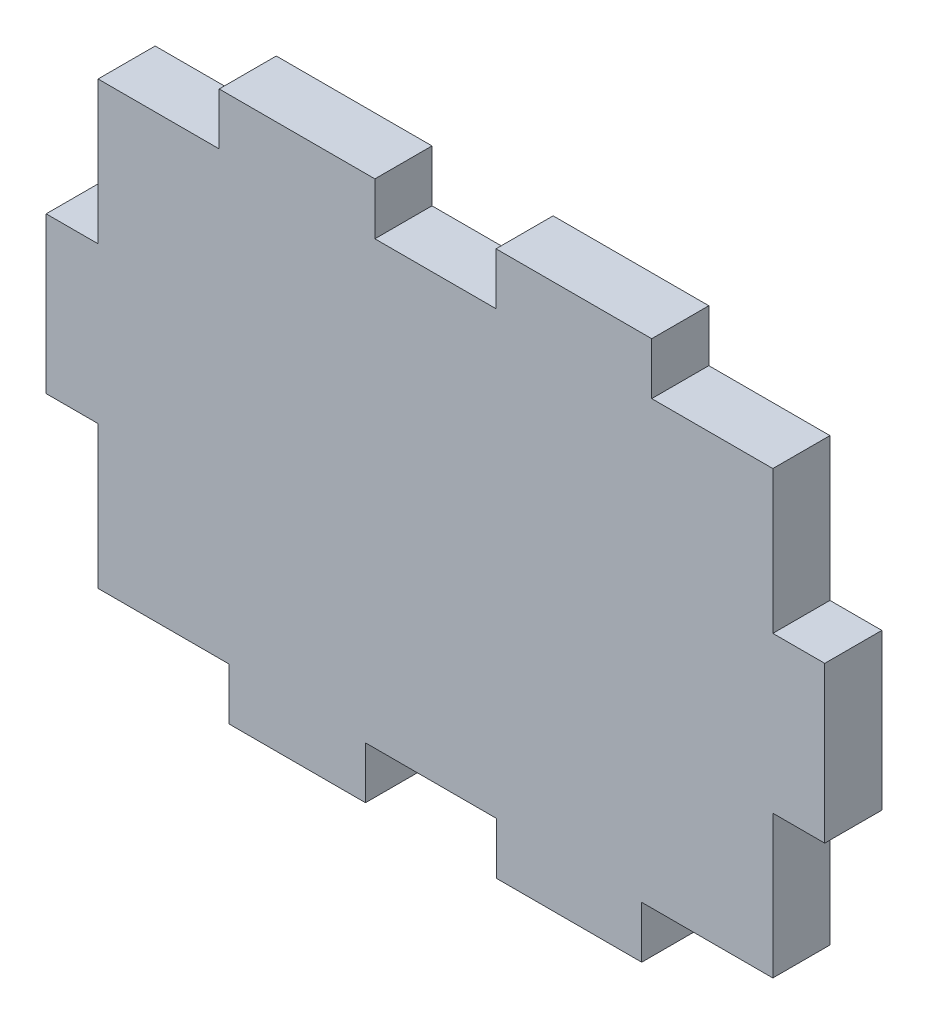
ISO-10303-21;
HEADER;
FILE_DESCRIPTION(('STEP AP214'),'2;1');
FILE_NAME('part.step','',(''),(''),'','','');
FILE_SCHEMA(('AUTOMOTIVE_DESIGN { 1 0 10303 214 1 1 1 1 }'));
ENDSEC;
DATA;
#1=APPLICATION_CONTEXT('core data for automotive mechanical design processes');
#2=APPLICATION_PROTOCOL_DEFINITION('international standard','automotive_design',2000,#1);
#3=PRODUCT_CONTEXT('',#1,'mechanical');
#4=PRODUCT('Part','Part','',(#3));
#5=PRODUCT_RELATED_PRODUCT_CATEGORY('part','',(#4));
#6=PRODUCT_DEFINITION_FORMATION('','',#4);
#7=PRODUCT_DEFINITION_CONTEXT('part definition',#1,'design');
#8=PRODUCT_DEFINITION('design','',#6,#7);
#9=PRODUCT_DEFINITION_SHAPE('','',#8);
#10=(LENGTH_UNIT() NAMED_UNIT(*) SI_UNIT(.MILLI.,.METRE.));
#11=(NAMED_UNIT(*) PLANE_ANGLE_UNIT() SI_UNIT($,.RADIAN.));
#12=(NAMED_UNIT(*) SI_UNIT($,.STERADIAN.) SOLID_ANGLE_UNIT());
#13=UNCERTAINTY_MEASURE_WITH_UNIT(LENGTH_MEASURE(1.E-05),#10,'distance_accuracy_value','');
#14=(GEOMETRIC_REPRESENTATION_CONTEXT(3) GLOBAL_UNCERTAINTY_ASSIGNED_CONTEXT((#13)) GLOBAL_UNIT_ASSIGNED_CONTEXT((#10,
#11,#12)) REPRESENTATION_CONTEXT('',''));
#15=CARTESIAN_POINT('',(0.,0.,0.));
#16=DIRECTION('',(0.,0.,1.));
#17=DIRECTION('',(1.,0.,0.));
#18=AXIS2_PLACEMENT_3D('',#15,#16,#17);
#19=CARTESIAN_POINT('',(33.02,7.62,5.588));
#20=DIRECTION('',(-1.,0.,0.));
#21=DIRECTION('',(0.,0.,1.));
#22=AXIS2_PLACEMENT_3D('',#19,#20,#21);
#23=PLANE('',#22);
#24=DIRECTION('',(0.,1.,0.));
#25=VECTOR('',#24,1.);
#26=CARTESIAN_POINT('',(33.02,7.62,0.));
#27=LINE('',#26,#25);
#28=CARTESIAN_POINT('',(33.02,7.62,0.));
#29=VERTEX_POINT('',#28);
#30=CARTESIAN_POINT('',(33.02,21.59,0.));
#31=VERTEX_POINT('',#30);
#32=EDGE_CURVE('E249',#29,#31,#27,.T.);
#33=ORIENTED_EDGE('',*,*,#32,.T.);
#34=DIRECTION('',(0.,0.,-1.));
#35=VECTOR('',#34,1.);
#36=CARTESIAN_POINT('',(33.02,21.59,5.588));
#37=LINE('',#36,#35);
#38=CARTESIAN_POINT('',(33.02,21.59,5.588));
#39=VERTEX_POINT('',#38);
#40=EDGE_CURVE('E11',#39,#31,#37,.T.);
#41=ORIENTED_EDGE('',*,*,#40,.F.);
#42=DIRECTION('',(0.,1.,0.));
#43=VECTOR('',#42,1.);
#44=CARTESIAN_POINT('',(33.02,7.62,5.588));
#45=LINE('',#44,#43);
#46=CARTESIAN_POINT('',(33.02,7.62,5.588));
#47=VERTEX_POINT('',#46);
#48=EDGE_CURVE('E303',#47,#39,#45,.T.);
#49=ORIENTED_EDGE('',*,*,#48,.F.);
#50=DIRECTION('',(0.,0.,-1.));
#51=VECTOR('',#50,1.);
#52=CARTESIAN_POINT('',(33.02,7.62,5.588));
#53=LINE('',#52,#51);
#54=EDGE_CURVE('E245',#47,#29,#53,.T.);
#55=ORIENTED_EDGE('',*,*,#54,.T.);
#56=EDGE_LOOP('',(#33,#41,#49,#55));
#57=FACE_BOUND('',#56,.T.);
#58=ADVANCED_FACE('F33',(#57),#23,.F.);
#59=CARTESIAN_POINT('',(21.1666666666667,21.59,5.588));
#60=DIRECTION('',(0.,-1.,0.));
#61=DIRECTION('',(0.,0.,-1.));
#62=AXIS2_PLACEMENT_3D('',#59,#60,#61);
#63=PLANE('',#62);
#64=DIRECTION('',(-1.,0.,0.));
#65=VECTOR('',#64,1.);
#66=CARTESIAN_POINT('',(21.1666666666667,21.59,0.));
#67=LINE('',#66,#65);
#68=CARTESIAN_POINT('',(21.1666666666667,21.59,0.));
#69=VERTEX_POINT('',#68);
#70=EDGE_CURVE('E252',#31,#69,#67,.T.);
#71=ORIENTED_EDGE('',*,*,#70,.T.);
#72=DIRECTION('',(0.,0.,-1.));
#73=VECTOR('',#72,1.);
#74=CARTESIAN_POINT('',(21.1666666666667,21.59,5.588));
#75=LINE('',#74,#73);
#76=CARTESIAN_POINT('',(21.1666666666667,21.59,5.588));
#77=VERTEX_POINT('',#76);
#78=EDGE_CURVE('E41',#77,#69,#75,.T.);
#79=ORIENTED_EDGE('',*,*,#78,.F.);
#80=DIRECTION('',(-1.,0.,0.));
#81=VECTOR('',#80,1.);
#82=CARTESIAN_POINT('',(21.1666666666667,21.59,5.588));
#83=LINE('',#82,#81);
#84=EDGE_CURVE('E152',#39,#77,#83,.T.);
#85=ORIENTED_EDGE('',*,*,#84,.F.);
#86=ORIENTED_EDGE('',*,*,#40,.T.);
#87=EDGE_LOOP('',(#71,#79,#85,#86));
#88=FACE_BOUND('',#87,.T.);
#89=ADVANCED_FACE('F461',(#88),#63,.F.);
#90=CARTESIAN_POINT('',(21.1666666666667,21.59,5.588));
#91=DIRECTION('',(-1.,0.,0.));
#92=DIRECTION('',(0.,0.,1.));
#93=AXIS2_PLACEMENT_3D('',#90,#91,#92);
#94=PLANE('',#93);
#95=DIRECTION('',(0.,1.,0.));
#96=VECTOR('',#95,1.);
#97=CARTESIAN_POINT('',(21.1666666666667,21.59,0.));
#98=LINE('',#97,#96);
#99=CARTESIAN_POINT('',(21.1666666666667,26.67,0.));
#100=VERTEX_POINT('',#99);
#101=EDGE_CURVE('E254',#69,#100,#98,.T.);
#102=ORIENTED_EDGE('',*,*,#101,.T.);
#103=DIRECTION('',(0.,0.,-1.));
#104=VECTOR('',#103,1.);
#105=CARTESIAN_POINT('',(21.1666666666667,26.67,5.588));
#106=LINE('',#105,#104);
#107=CARTESIAN_POINT('',(21.1666666666667,26.67,5.588));
#108=VERTEX_POINT('',#107);
#109=EDGE_CURVE('E370',#108,#100,#106,.T.);
#110=ORIENTED_EDGE('',*,*,#109,.F.);
#111=DIRECTION('',(0.,1.,0.));
#112=VECTOR('',#111,1.);
#113=CARTESIAN_POINT('',(21.1666666666667,21.59,5.588));
#114=LINE('',#113,#112);
#115=EDGE_CURVE('E378',#77,#108,#114,.T.);
#116=ORIENTED_EDGE('',*,*,#115,.F.);
#117=ORIENTED_EDGE('',*,*,#78,.T.);
#118=EDGE_LOOP('',(#102,#110,#116,#117));
#119=FACE_BOUND('',#118,.T.);
#120=ADVANCED_FACE('F376',(#119),#94,.F.);
#121=CARTESIAN_POINT('',(5.92666666666666,26.67,5.588));
#122=DIRECTION('',(0.,-1.,0.));
#123=DIRECTION('',(0.,0.,-1.));
#124=AXIS2_PLACEMENT_3D('',#121,#122,#123);
#125=PLANE('',#124);
#126=DIRECTION('',(-1.,0.,0.));
#127=VECTOR('',#126,1.);
#128=CARTESIAN_POINT('',(5.92666666666666,26.67,0.));
#129=LINE('',#128,#127);
#130=CARTESIAN_POINT('',(5.92666666666666,26.67,0.));
#131=VERTEX_POINT('',#130);
#132=EDGE_CURVE('E256',#100,#131,#129,.T.);
#133=ORIENTED_EDGE('',*,*,#132,.T.);
#134=DIRECTION('',(0.,0.,-1.));
#135=VECTOR('',#134,1.);
#136=CARTESIAN_POINT('',(5.92666666666666,26.67,5.588));
#137=LINE('',#136,#135);
#138=CARTESIAN_POINT('',(5.92666666666666,26.67,5.588));
#139=VERTEX_POINT('',#138);
#140=EDGE_CURVE('E367',#139,#131,#137,.T.);
#141=ORIENTED_EDGE('',*,*,#140,.F.);
#142=DIRECTION('',(-1.,0.,0.));
#143=VECTOR('',#142,1.);
#144=CARTESIAN_POINT('',(5.92666666666666,26.67,5.588));
#145=LINE('',#144,#143);
#146=EDGE_CURVE('E396',#108,#139,#145,.T.);
#147=ORIENTED_EDGE('',*,*,#146,.F.);
#148=ORIENTED_EDGE('',*,*,#109,.T.);
#149=EDGE_LOOP('',(#133,#141,#147,#148));
#150=FACE_BOUND('',#149,.T.);
#151=ADVANCED_FACE('F387',(#150),#125,.F.);
#152=CARTESIAN_POINT('',(5.92666666666666,21.59,5.588));
#153=DIRECTION('',(1.,0.,0.));
#154=DIRECTION('',(0.,1.,0.));
#155=AXIS2_PLACEMENT_3D('',#152,#153,#154);
#156=PLANE('',#155);
#157=DIRECTION('',(0.,-1.,0.));
#158=VECTOR('',#157,1.);
#159=CARTESIAN_POINT('',(5.92666666666666,21.59,0.));
#160=LINE('',#159,#158);
#161=CARTESIAN_POINT('',(5.92666666666666,21.59,0.));
#162=VERTEX_POINT('',#161);
#163=EDGE_CURVE('E258',#131,#162,#160,.T.);
#164=ORIENTED_EDGE('',*,*,#163,.T.);
#165=DIRECTION('',(0.,0.,-1.));
#166=VECTOR('',#165,1.);
#167=CARTESIAN_POINT('',(5.92666666666666,21.59,5.588));
#168=LINE('',#167,#166);
#169=CARTESIAN_POINT('',(5.92666666666666,21.59,5.588));
#170=VERTEX_POINT('',#169);
#171=EDGE_CURVE('E364',#170,#162,#168,.T.);
#172=ORIENTED_EDGE('',*,*,#171,.F.);
#173=DIRECTION('',(0.,-1.,0.));
#174=VECTOR('',#173,1.);
#175=CARTESIAN_POINT('',(5.92666666666666,21.59,5.588));
#176=LINE('',#175,#174);
#177=EDGE_CURVE('E393',#139,#170,#176,.T.);
#178=ORIENTED_EDGE('',*,*,#177,.F.);
#179=ORIENTED_EDGE('',*,*,#140,.T.);
#180=EDGE_LOOP('',(#164,#172,#178,#179));
#181=FACE_BOUND('',#180,.T.);
#182=ADVANCED_FACE('F391',(#181),#156,.F.);
#183=CARTESIAN_POINT('',(-5.92666666666667,21.59,5.588));
#184=DIRECTION('',(0.,-1.,0.));
#185=DIRECTION('',(0.,0.,-1.));
#186=AXIS2_PLACEMENT_3D('',#183,#184,#185);
#187=PLANE('',#186);
#188=DIRECTION('',(-1.,0.,0.));
#189=VECTOR('',#188,1.);
#190=CARTESIAN_POINT('',(-5.92666666666667,21.59,0.));
#191=LINE('',#190,#189);
#192=CARTESIAN_POINT('',(-5.92666666666667,21.59,0.));
#193=VERTEX_POINT('',#192);
#194=EDGE_CURVE('E260',#162,#193,#191,.T.);
#195=ORIENTED_EDGE('',*,*,#194,.T.);
#196=DIRECTION('',(0.,0.,-1.));
#197=VECTOR('',#196,1.);
#198=CARTESIAN_POINT('',(-5.92666666666667,21.59,5.588));
#199=LINE('',#198,#197);
#200=CARTESIAN_POINT('',(-5.92666666666667,21.59,5.588));
#201=VERTEX_POINT('',#200);
#202=EDGE_CURVE('E361',#201,#193,#199,.T.);
#203=ORIENTED_EDGE('',*,*,#202,.F.);
#204=DIRECTION('',(-1.,0.,0.));
#205=VECTOR('',#204,1.);
#206=CARTESIAN_POINT('',(-5.92666666666667,21.59,5.588));
#207=LINE('',#206,#205);
#208=EDGE_CURVE('E395',#170,#201,#207,.T.);
#209=ORIENTED_EDGE('',*,*,#208,.F.);
#210=ORIENTED_EDGE('',*,*,#171,.T.);
#211=EDGE_LOOP('',(#195,#203,#209,#210));
#212=FACE_BOUND('',#211,.T.);
#213=ADVANCED_FACE('F474',(#212),#187,.F.);
#214=CARTESIAN_POINT('',(-5.92666666666667,21.59,5.588));
#215=DIRECTION('',(-1.,0.,0.));
#216=DIRECTION('',(0.,0.,1.));
#217=AXIS2_PLACEMENT_3D('',#214,#215,#216);
#218=PLANE('',#217);
#219=DIRECTION('',(0.,1.,0.));
#220=VECTOR('',#219,1.);
#221=CARTESIAN_POINT('',(-5.92666666666667,21.59,0.));
#222=LINE('',#221,#220);
#223=CARTESIAN_POINT('',(-5.92666666666667,26.67,0.));
#224=VERTEX_POINT('',#223);
#225=EDGE_CURVE('E262',#193,#224,#222,.T.);
#226=ORIENTED_EDGE('',*,*,#225,.T.);
#227=DIRECTION('',(0.,0.,-1.));
#228=VECTOR('',#227,1.);
#229=CARTESIAN_POINT('',(-5.92666666666667,26.67,5.588));
#230=LINE('',#229,#228);
#231=CARTESIAN_POINT('',(-5.92666666666667,26.67,5.588));
#232=VERTEX_POINT('',#231);
#233=EDGE_CURVE('E358',#232,#224,#230,.T.);
#234=ORIENTED_EDGE('',*,*,#233,.F.);
#235=DIRECTION('',(0.,1.,0.));
#236=VECTOR('',#235,1.);
#237=CARTESIAN_POINT('',(-5.92666666666667,21.59,5.588));
#238=LINE('',#237,#236);
#239=EDGE_CURVE('E398',#201,#232,#238,.T.);
#240=ORIENTED_EDGE('',*,*,#239,.F.);
#241=ORIENTED_EDGE('',*,*,#202,.T.);
#242=EDGE_LOOP('',(#226,#234,#240,#241));
#243=FACE_BOUND('',#242,.T.);
#244=ADVANCED_FACE('F477',(#243),#218,.F.);
#245=CARTESIAN_POINT('',(-21.1666666666667,26.67,5.588));
#246=DIRECTION('',(0.,-1.,0.));
#247=DIRECTION('',(0.,0.,-1.));
#248=AXIS2_PLACEMENT_3D('',#245,#246,#247);
#249=PLANE('',#248);
#250=DIRECTION('',(-1.,0.,0.));
#251=VECTOR('',#250,1.);
#252=CARTESIAN_POINT('',(-21.1666666666667,26.67,0.));
#253=LINE('',#252,#251);
#254=CARTESIAN_POINT('',(-21.1666666666667,26.67,0.));
#255=VERTEX_POINT('',#254);
#256=EDGE_CURVE('E264',#224,#255,#253,.T.);
#257=ORIENTED_EDGE('',*,*,#256,.T.);
#258=DIRECTION('',(0.,0.,-1.));
#259=VECTOR('',#258,1.);
#260=CARTESIAN_POINT('',(-21.1666666666667,26.67,5.588));
#261=LINE('',#260,#259);
#262=CARTESIAN_POINT('',(-21.1666666666667,26.67,5.588));
#263=VERTEX_POINT('',#262);
#264=EDGE_CURVE('E355',#263,#255,#261,.T.);
#265=ORIENTED_EDGE('',*,*,#264,.F.);
#266=DIRECTION('',(-1.,0.,0.));
#267=VECTOR('',#266,1.);
#268=CARTESIAN_POINT('',(-21.1666666666667,26.67,5.588));
#269=LINE('',#268,#267);
#270=EDGE_CURVE('E404',#232,#263,#269,.T.);
#271=ORIENTED_EDGE('',*,*,#270,.F.);
#272=ORIENTED_EDGE('',*,*,#233,.T.);
#273=EDGE_LOOP('',(#257,#265,#271,#272));
#274=FACE_BOUND('',#273,.T.);
#275=ADVANCED_FACE('F481',(#274),#249,.F.);
#276=CARTESIAN_POINT('',(-21.1666666666667,21.59,5.588));
#277=DIRECTION('',(1.,0.,0.));
#278=DIRECTION('',(0.,0.,-1.));
#279=AXIS2_PLACEMENT_3D('',#276,#277,#278);
#280=PLANE('',#279);
#281=DIRECTION('',(0.,-1.,0.));
#282=VECTOR('',#281,1.);
#283=CARTESIAN_POINT('',(-21.1666666666667,21.59,0.));
#284=LINE('',#283,#282);
#285=CARTESIAN_POINT('',(-21.1666666666667,21.59,0.));
#286=VERTEX_POINT('',#285);
#287=EDGE_CURVE('E266',#255,#286,#284,.T.);
#288=ORIENTED_EDGE('',*,*,#287,.T.);
#289=DIRECTION('',(0.,0.,-1.));
#290=VECTOR('',#289,1.);
#291=CARTESIAN_POINT('',(-21.1666666666667,21.59,5.588));
#292=LINE('',#291,#290);
#293=CARTESIAN_POINT('',(-21.1666666666667,21.59,5.588));
#294=VERTEX_POINT('',#293);
#295=EDGE_CURVE('E352',#294,#286,#292,.T.);
#296=ORIENTED_EDGE('',*,*,#295,.F.);
#297=DIRECTION('',(0.,-1.,0.));
#298=VECTOR('',#297,1.);
#299=CARTESIAN_POINT('',(-21.1666666666667,21.59,5.588));
#300=LINE('',#299,#298);
#301=EDGE_CURVE('E406',#263,#294,#300,.T.);
#302=ORIENTED_EDGE('',*,*,#301,.F.);
#303=ORIENTED_EDGE('',*,*,#264,.T.);
#304=EDGE_LOOP('',(#288,#296,#302,#303));
#305=FACE_BOUND('',#304,.T.);
#306=ADVANCED_FACE('F485',(#305),#280,.F.);
#307=CARTESIAN_POINT('',(-33.02,21.59,5.588));
#308=DIRECTION('',(0.,-1.,0.));
#309=DIRECTION('',(0.,0.,-1.));
#310=AXIS2_PLACEMENT_3D('',#307,#308,#309);
#311=PLANE('',#310);
#312=DIRECTION('',(-1.,0.,0.));
#313=VECTOR('',#312,1.);
#314=CARTESIAN_POINT('',(-33.02,21.59,0.));
#315=LINE('',#314,#313);
#316=CARTESIAN_POINT('',(-33.02,21.59,0.));
#317=VERTEX_POINT('',#316);
#318=EDGE_CURVE('E268',#286,#317,#315,.T.);
#319=ORIENTED_EDGE('',*,*,#318,.T.);
#320=DIRECTION('',(0.,0.,-1.));
#321=VECTOR('',#320,1.);
#322=CARTESIAN_POINT('',(-33.02,21.59,5.588));
#323=LINE('',#322,#321);
#324=CARTESIAN_POINT('',(-33.02,21.59,5.588));
#325=VERTEX_POINT('',#324);
#326=EDGE_CURVE('E349',#325,#317,#323,.T.);
#327=ORIENTED_EDGE('',*,*,#326,.F.);
#328=DIRECTION('',(-1.,0.,0.));
#329=VECTOR('',#328,1.);
#330=CARTESIAN_POINT('',(-33.02,21.59,5.588));
#331=LINE('',#330,#329);
#332=EDGE_CURVE('E408',#294,#325,#331,.T.);
#333=ORIENTED_EDGE('',*,*,#332,.F.);
#334=ORIENTED_EDGE('',*,*,#295,.T.);
#335=EDGE_LOOP('',(#319,#327,#333,#334));
#336=FACE_BOUND('',#335,.T.);
#337=ADVANCED_FACE('F489',(#336),#311,.F.);
#338=CARTESIAN_POINT('',(-33.02,7.62,5.588));
#339=DIRECTION('',(1.,0.,0.));
#340=DIRECTION('',(0.,0.,-1.));
#341=AXIS2_PLACEMENT_3D('',#338,#339,#340);
#342=PLANE('',#341);
#343=DIRECTION('',(0.,-1.,0.));
#344=VECTOR('',#343,1.);
#345=CARTESIAN_POINT('',(-33.02,7.62,0.));
#346=LINE('',#345,#344);
#347=CARTESIAN_POINT('',(-33.02,7.62,0.));
#348=VERTEX_POINT('',#347);
#349=EDGE_CURVE('E270',#317,#348,#346,.T.);
#350=ORIENTED_EDGE('',*,*,#349,.T.);
#351=DIRECTION('',(0.,0.,-1.));
#352=VECTOR('',#351,1.);
#353=CARTESIAN_POINT('',(-33.02,7.62,5.588));
#354=LINE('',#353,#352);
#355=CARTESIAN_POINT('',(-33.02,7.62,5.588));
#356=VERTEX_POINT('',#355);
#357=EDGE_CURVE('E346',#356,#348,#354,.T.);
#358=ORIENTED_EDGE('',*,*,#357,.F.);
#359=DIRECTION('',(0.,-1.,0.));
#360=VECTOR('',#359,1.);
#361=CARTESIAN_POINT('',(-33.02,7.62,5.588));
#362=LINE('',#361,#360);
#363=EDGE_CURVE('E410',#325,#356,#362,.T.);
#364=ORIENTED_EDGE('',*,*,#363,.F.);
#365=ORIENTED_EDGE('',*,*,#326,.T.);
#366=EDGE_LOOP('',(#350,#358,#364,#365));
#367=FACE_BOUND('',#366,.T.);
#368=ADVANCED_FACE('F493',(#367),#342,.F.);
#369=CARTESIAN_POINT('',(-33.02,7.62,5.588));
#370=DIRECTION('',(0.,-1.,0.));
#371=DIRECTION('',(1.,0.,0.));
#372=AXIS2_PLACEMENT_3D('',#369,#370,#371);
#373=PLANE('',#372);
#374=DIRECTION('',(-1.,0.,0.));
#375=VECTOR('',#374,1.);
#376=CARTESIAN_POINT('',(-33.02,7.62,0.));
#377=LINE('',#376,#375);
#378=CARTESIAN_POINT('',(-38.1,7.62,0.));
#379=VERTEX_POINT('',#378);
#380=EDGE_CURVE('E272',#348,#379,#377,.T.);
#381=ORIENTED_EDGE('',*,*,#380,.T.);
#382=DIRECTION('',(0.,0.,-1.));
#383=VECTOR('',#382,1.);
#384=CARTESIAN_POINT('',(-38.1,7.62,5.588));
#385=LINE('',#384,#383);
#386=CARTESIAN_POINT('',(-38.1,7.62,5.588));
#387=VERTEX_POINT('',#386);
#388=EDGE_CURVE('E343',#387,#379,#385,.T.);
#389=ORIENTED_EDGE('',*,*,#388,.F.);
#390=DIRECTION('',(-1.,0.,0.));
#391=VECTOR('',#390,1.);
#392=CARTESIAN_POINT('',(-33.02,7.62,5.588));
#393=LINE('',#392,#391);
#394=EDGE_CURVE('E412',#356,#387,#393,.T.);
#395=ORIENTED_EDGE('',*,*,#394,.F.);
#396=ORIENTED_EDGE('',*,*,#357,.T.);
#397=EDGE_LOOP('',(#381,#389,#395,#396));
#398=FACE_BOUND('',#397,.T.);
#399=ADVANCED_FACE('F497',(#398),#373,.F.);
#400=CARTESIAN_POINT('',(-38.1,7.62,5.588));
#401=DIRECTION('',(1.,0.,0.));
#402=DIRECTION('',(0.,0.,-1.));
#403=AXIS2_PLACEMENT_3D('',#400,#401,#402);
#404=PLANE('',#403);
#405=DIRECTION('',(0.,-1.,0.));
#406=VECTOR('',#405,1.);
#407=CARTESIAN_POINT('',(-38.1,7.62,0.));
#408=LINE('',#407,#406);
#409=CARTESIAN_POINT('',(-38.1,-7.62,0.));
#410=VERTEX_POINT('',#409);
#411=EDGE_CURVE('E274',#379,#410,#408,.T.);
#412=ORIENTED_EDGE('',*,*,#411,.T.);
#413=DIRECTION('',(0.,0.,-1.));
#414=VECTOR('',#413,1.);
#415=CARTESIAN_POINT('',(-38.1,-7.62,5.588));
#416=LINE('',#415,#414);
#417=CARTESIAN_POINT('',(-38.1,-7.62,5.588));
#418=VERTEX_POINT('',#417);
#419=EDGE_CURVE('E340',#418,#410,#416,.T.);
#420=ORIENTED_EDGE('',*,*,#419,.F.);
#421=DIRECTION('',(0.,-1.,0.));
#422=VECTOR('',#421,1.);
#423=CARTESIAN_POINT('',(-38.1,7.62,5.588));
#424=LINE('',#423,#422);
#425=EDGE_CURVE('E414',#387,#418,#424,.T.);
#426=ORIENTED_EDGE('',*,*,#425,.F.);
#427=ORIENTED_EDGE('',*,*,#388,.T.);
#428=EDGE_LOOP('',(#412,#420,#426,#427));
#429=FACE_BOUND('',#428,.T.);
#430=ADVANCED_FACE('F501',(#429),#404,.F.);
#431=CARTESIAN_POINT('',(-33.02,-7.62,5.588));
#432=DIRECTION('',(0.,1.,0.));
#433=DIRECTION('',(0.,0.,1.));
#434=AXIS2_PLACEMENT_3D('',#431,#432,#433);
#435=PLANE('',#434);
#436=DIRECTION('',(1.,0.,0.));
#437=VECTOR('',#436,1.);
#438=CARTESIAN_POINT('',(-33.02,-7.62,0.));
#439=LINE('',#438,#437);
#440=CARTESIAN_POINT('',(-33.02,-7.62,0.));
#441=VERTEX_POINT('',#440);
#442=EDGE_CURVE('E276',#410,#441,#439,.T.);
#443=ORIENTED_EDGE('',*,*,#442,.T.);
#444=DIRECTION('',(0.,0.,-1.));
#445=VECTOR('',#444,1.);
#446=CARTESIAN_POINT('',(-33.02,-7.62,5.588));
#447=LINE('',#446,#445);
#448=CARTESIAN_POINT('',(-33.02,-7.62,5.588));
#449=VERTEX_POINT('',#448);
#450=EDGE_CURVE('E337',#449,#441,#447,.T.);
#451=ORIENTED_EDGE('',*,*,#450,.F.);
#452=DIRECTION('',(1.,0.,0.));
#453=VECTOR('',#452,1.);
#454=CARTESIAN_POINT('',(-33.02,-7.62,5.588));
#455=LINE('',#454,#453);
#456=EDGE_CURVE('E416',#418,#449,#455,.T.);
#457=ORIENTED_EDGE('',*,*,#456,.F.);
#458=ORIENTED_EDGE('',*,*,#419,.T.);
#459=EDGE_LOOP('',(#443,#451,#457,#458));
#460=FACE_BOUND('',#459,.T.);
#461=ADVANCED_FACE('F505',(#460),#435,.F.);
#462=CARTESIAN_POINT('',(-33.02,-21.59,5.588));
#463=DIRECTION('',(1.,0.,0.));
#464=DIRECTION('',(0.,0.,-1.));
#465=AXIS2_PLACEMENT_3D('',#462,#463,#464);
#466=PLANE('',#465);
#467=DIRECTION('',(0.,-1.,0.));
#468=VECTOR('',#467,1.);
#469=CARTESIAN_POINT('',(-33.02,-21.59,0.));
#470=LINE('',#469,#468);
#471=CARTESIAN_POINT('',(-33.02,-21.59,0.));
#472=VERTEX_POINT('',#471);
#473=EDGE_CURVE('E278',#441,#472,#470,.T.);
#474=ORIENTED_EDGE('',*,*,#473,.T.);
#475=DIRECTION('',(0.,0.,-1.));
#476=VECTOR('',#475,1.);
#477=CARTESIAN_POINT('',(-33.02,-21.59,5.588));
#478=LINE('',#477,#476);
#479=CARTESIAN_POINT('',(-33.02,-21.59,5.588));
#480=VERTEX_POINT('',#479);
#481=EDGE_CURVE('E334',#480,#472,#478,.T.);
#482=ORIENTED_EDGE('',*,*,#481,.F.);
#483=DIRECTION('',(0.,-1.,0.));
#484=VECTOR('',#483,1.);
#485=CARTESIAN_POINT('',(-33.02,-21.59,5.588));
#486=LINE('',#485,#484);
#487=EDGE_CURVE('E418',#449,#480,#486,.T.);
#488=ORIENTED_EDGE('',*,*,#487,.F.);
#489=ORIENTED_EDGE('',*,*,#450,.T.);
#490=EDGE_LOOP('',(#474,#482,#488,#489));
#491=FACE_BOUND('',#490,.T.);
#492=ADVANCED_FACE('F509',(#491),#466,.F.);
#493=CARTESIAN_POINT('',(-33.02,-21.59,5.588));
#494=DIRECTION('',(0.,1.,0.));
#495=DIRECTION('',(-1.,0.,0.));
#496=AXIS2_PLACEMENT_3D('',#493,#494,#495);
#497=PLANE('',#496);
#498=DIRECTION('',(1.,0.,0.));
#499=VECTOR('',#498,1.);
#500=CARTESIAN_POINT('',(-33.02,-21.59,0.));
#501=LINE('',#500,#499);
#502=CARTESIAN_POINT('',(-20.188138196102,-21.59,0.));
#503=VERTEX_POINT('',#502);
#504=EDGE_CURVE('E280',#472,#503,#501,.T.);
#505=ORIENTED_EDGE('',*,*,#504,.T.);
#506=DIRECTION('',(0.,0.,-1.));
#507=VECTOR('',#506,1.);
#508=CARTESIAN_POINT('',(-20.188138196102,-21.59,5.588));
#509=LINE('',#508,#507);
#510=CARTESIAN_POINT('',(-20.188138196102,-21.59,5.588));
#511=VERTEX_POINT('',#510);
#512=EDGE_CURVE('E331',#511,#503,#509,.T.);
#513=ORIENTED_EDGE('',*,*,#512,.F.);
#514=DIRECTION('',(1.,0.,0.));
#515=VECTOR('',#514,1.);
#516=CARTESIAN_POINT('',(-33.02,-21.59,5.588));
#517=LINE('',#516,#515);
#518=EDGE_CURVE('E420',#480,#511,#517,.T.);
#519=ORIENTED_EDGE('',*,*,#518,.F.);
#520=ORIENTED_EDGE('',*,*,#481,.T.);
#521=EDGE_LOOP('',(#505,#513,#519,#520));
#522=FACE_BOUND('',#521,.T.);
#523=ADVANCED_FACE('F513',(#522),#497,.F.);
#524=CARTESIAN_POINT('',(-20.188138196102,-21.59,5.588));
#525=DIRECTION('',(1.,0.,0.));
#526=DIRECTION('',(0.,0.,-1.));
#527=AXIS2_PLACEMENT_3D('',#524,#525,#526);
#528=PLANE('',#527);
#529=DIRECTION('',(0.,-1.,0.));
#530=VECTOR('',#529,1.);
#531=CARTESIAN_POINT('',(-20.188138196102,-21.59,0.));
#532=LINE('',#531,#530);
#533=CARTESIAN_POINT('',(-20.188138196102,-26.67,0.));
#534=VERTEX_POINT('',#533);
#535=EDGE_CURVE('E282',#503,#534,#532,.T.);
#536=ORIENTED_EDGE('',*,*,#535,.T.);
#537=DIRECTION('',(0.,0.,-1.));
#538=VECTOR('',#537,1.);
#539=CARTESIAN_POINT('',(-20.188138196102,-26.67,5.588));
#540=LINE('',#539,#538);
#541=CARTESIAN_POINT('',(-20.188138196102,-26.67,5.588));
#542=VERTEX_POINT('',#541);
#543=EDGE_CURVE('E328',#542,#534,#540,.T.);
#544=ORIENTED_EDGE('',*,*,#543,.F.);
#545=DIRECTION('',(0.,-1.,0.));
#546=VECTOR('',#545,1.);
#547=CARTESIAN_POINT('',(-20.188138196102,-21.59,5.588));
#548=LINE('',#547,#546);
#549=EDGE_CURVE('E422',#511,#542,#548,.T.);
#550=ORIENTED_EDGE('',*,*,#549,.F.);
#551=ORIENTED_EDGE('',*,*,#512,.T.);
#552=EDGE_LOOP('',(#536,#544,#550,#551));
#553=FACE_BOUND('',#552,.T.);
#554=ADVANCED_FACE('F517',(#553),#528,.F.);
#555=CARTESIAN_POINT('',(-6.84662458536896,-26.67,5.588));
#556=DIRECTION('',(0.,1.,0.));
#557=DIRECTION('',(-1.,0.,0.));
#558=AXIS2_PLACEMENT_3D('',#555,#556,#557);
#559=PLANE('',#558);
#560=DIRECTION('',(1.,0.,0.));
#561=VECTOR('',#560,1.);
#562=CARTESIAN_POINT('',(-6.84662458536896,-26.67,0.));
#563=LINE('',#562,#561);
#564=CARTESIAN_POINT('',(-6.84662458536896,-26.67,0.));
#565=VERTEX_POINT('',#564);
#566=EDGE_CURVE('E284',#534,#565,#563,.T.);
#567=ORIENTED_EDGE('',*,*,#566,.T.);
#568=DIRECTION('',(0.,0.,-1.));
#569=VECTOR('',#568,1.);
#570=CARTESIAN_POINT('',(-6.84662458536896,-26.67,5.588));
#571=LINE('',#570,#569);
#572=CARTESIAN_POINT('',(-6.84662458536896,-26.67,5.588));
#573=VERTEX_POINT('',#572);
#574=EDGE_CURVE('E325',#573,#565,#571,.T.);
#575=ORIENTED_EDGE('',*,*,#574,.F.);
#576=DIRECTION('',(1.,0.,0.));
#577=VECTOR('',#576,1.);
#578=CARTESIAN_POINT('',(-6.84662458536896,-26.67,5.588));
#579=LINE('',#578,#577);
#580=EDGE_CURVE('E424',#542,#573,#579,.T.);
#581=ORIENTED_EDGE('',*,*,#580,.F.);
#582=ORIENTED_EDGE('',*,*,#543,.T.);
#583=EDGE_LOOP('',(#567,#575,#581,#582));
#584=FACE_BOUND('',#583,.T.);
#585=ADVANCED_FACE('F521',(#584),#559,.F.);
#586=CARTESIAN_POINT('',(-6.84662458536896,-21.59,5.588));
#587=DIRECTION('',(-1.,0.,0.));
#588=DIRECTION('',(0.,0.,1.));
#589=AXIS2_PLACEMENT_3D('',#586,#587,#588);
#590=PLANE('',#589);
#591=DIRECTION('',(0.,1.,0.));
#592=VECTOR('',#591,1.);
#593=CARTESIAN_POINT('',(-6.84662458536896,-21.59,0.));
#594=LINE('',#593,#592);
#595=CARTESIAN_POINT('',(-6.84662458536896,-21.59,0.));
#596=VERTEX_POINT('',#595);
#597=EDGE_CURVE('E286',#565,#596,#594,.T.);
#598=ORIENTED_EDGE('',*,*,#597,.T.);
#599=DIRECTION('',(0.,0.,-1.));
#600=VECTOR('',#599,1.);
#601=CARTESIAN_POINT('',(-6.84662458536896,-21.59,5.588));
#602=LINE('',#601,#600);
#603=CARTESIAN_POINT('',(-6.84662458536896,-21.59,5.588));
#604=VERTEX_POINT('',#603);
#605=EDGE_CURVE('E322',#604,#596,#602,.T.);
#606=ORIENTED_EDGE('',*,*,#605,.F.);
#607=DIRECTION('',(0.,1.,0.));
#608=VECTOR('',#607,1.);
#609=CARTESIAN_POINT('',(-6.84662458536896,-21.59,5.588));
#610=LINE('',#609,#608);
#611=EDGE_CURVE('E426',#573,#604,#610,.T.);
#612=ORIENTED_EDGE('',*,*,#611,.F.);
#613=ORIENTED_EDGE('',*,*,#574,.T.);
#614=EDGE_LOOP('',(#598,#606,#612,#613));
#615=FACE_BOUND('',#614,.T.);
#616=ADVANCED_FACE('F525',(#615),#590,.F.);
#617=CARTESIAN_POINT('',(-6.84662458536896,-21.59,5.588));
#618=DIRECTION('',(0.,1.,0.));
#619=DIRECTION('',(0.,0.,1.));
#620=AXIS2_PLACEMENT_3D('',#617,#618,#619);
#621=PLANE('',#620);
#622=DIRECTION('',(1.,0.,0.));
#623=VECTOR('',#622,1.);
#624=CARTESIAN_POINT('',(-6.84662458536896,-21.59,0.));
#625=LINE('',#624,#623);
#626=CARTESIAN_POINT('',(5.98523721852901,-21.59,0.));
#627=VERTEX_POINT('',#626);
#628=EDGE_CURVE('E288',#596,#627,#625,.T.);
#629=ORIENTED_EDGE('',*,*,#628,.T.);
#630=DIRECTION('',(0.,0.,-1.));
#631=VECTOR('',#630,1.);
#632=CARTESIAN_POINT('',(5.98523721852901,-21.59,5.588));
#633=LINE('',#632,#631);
#634=CARTESIAN_POINT('',(5.98523721852901,-21.59,5.588));
#635=VERTEX_POINT('',#634);
#636=EDGE_CURVE('E319',#635,#627,#633,.T.);
#637=ORIENTED_EDGE('',*,*,#636,.F.);
#638=DIRECTION('',(1.,0.,0.));
#639=VECTOR('',#638,1.);
#640=CARTESIAN_POINT('',(-6.84662458536896,-21.59,5.588));
#641=LINE('',#640,#639);
#642=EDGE_CURVE('E428',#604,#635,#641,.T.);
#643=ORIENTED_EDGE('',*,*,#642,.F.);
#644=ORIENTED_EDGE('',*,*,#605,.T.);
#645=EDGE_LOOP('',(#629,#637,#643,#644));
#646=FACE_BOUND('',#645,.T.);
#647=ADVANCED_FACE('F529',(#646),#621,.F.);
#648=CARTESIAN_POINT('',(5.98523721852901,-21.59,5.588));
#649=DIRECTION('',(1.,0.,0.));
#650=DIRECTION('',(0.,1.,0.));
#651=AXIS2_PLACEMENT_3D('',#648,#649,#650);
#652=PLANE('',#651);
#653=DIRECTION('',(0.,-1.,0.));
#654=VECTOR('',#653,1.);
#655=CARTESIAN_POINT('',(5.98523721852901,-21.59,0.));
#656=LINE('',#655,#654);
#657=CARTESIAN_POINT('',(5.98523721852901,-26.67,0.));
#658=VERTEX_POINT('',#657);
#659=EDGE_CURVE('E290',#627,#658,#656,.T.);
#660=ORIENTED_EDGE('',*,*,#659,.T.);
#661=DIRECTION('',(0.,0.,-1.));
#662=VECTOR('',#661,1.);
#663=CARTESIAN_POINT('',(5.98523721852901,-26.67,5.588));
#664=LINE('',#663,#662);
#665=CARTESIAN_POINT('',(5.98523721852901,-26.67,5.588));
#666=VERTEX_POINT('',#665);
#667=EDGE_CURVE('E316',#666,#658,#664,.T.);
#668=ORIENTED_EDGE('',*,*,#667,.F.);
#669=DIRECTION('',(0.,-1.,0.));
#670=VECTOR('',#669,1.);
#671=CARTESIAN_POINT('',(5.98523721852901,-21.59,5.588));
#672=LINE('',#671,#670);
#673=EDGE_CURVE('E430',#635,#666,#672,.T.);
#674=ORIENTED_EDGE('',*,*,#673,.F.);
#675=ORIENTED_EDGE('',*,*,#636,.T.);
#676=EDGE_LOOP('',(#660,#668,#674,#675));
#677=FACE_BOUND('',#676,.T.);
#678=ADVANCED_FACE('F533',(#677),#652,.F.);
#679=CARTESIAN_POINT('',(5.98523721852901,-26.67,5.588));
#680=DIRECTION('',(0.,1.,0.));
#681=DIRECTION('',(0.,0.,1.));
#682=AXIS2_PLACEMENT_3D('',#679,#680,#681);
#683=PLANE('',#682);
#684=DIRECTION('',(1.,0.,0.));
#685=VECTOR('',#684,1.);
#686=CARTESIAN_POINT('',(5.98523721852901,-26.67,0.));
#687=LINE('',#686,#685);
#688=CARTESIAN_POINT('',(20.188138196102,-26.67,0.));
#689=VERTEX_POINT('',#688);
#690=EDGE_CURVE('E292',#658,#689,#687,.T.);
#691=ORIENTED_EDGE('',*,*,#690,.T.);
#692=DIRECTION('',(0.,0.,-1.));
#693=VECTOR('',#692,1.);
#694=CARTESIAN_POINT('',(20.188138196102,-26.67,5.588));
#695=LINE('',#694,#693);
#696=CARTESIAN_POINT('',(20.188138196102,-26.67,5.588));
#697=VERTEX_POINT('',#696);
#698=EDGE_CURVE('E313',#697,#689,#695,.T.);
#699=ORIENTED_EDGE('',*,*,#698,.F.);
#700=DIRECTION('',(1.,0.,0.));
#701=VECTOR('',#700,1.);
#702=CARTESIAN_POINT('',(5.98523721852901,-26.67,5.588));
#703=LINE('',#702,#701);
#704=EDGE_CURVE('E432',#666,#697,#703,.T.);
#705=ORIENTED_EDGE('',*,*,#704,.F.);
#706=ORIENTED_EDGE('',*,*,#667,.T.);
#707=EDGE_LOOP('',(#691,#699,#705,#706));
#708=FACE_BOUND('',#707,.T.);
#709=ADVANCED_FACE('F537',(#708),#683,.F.);
#710=CARTESIAN_POINT('',(20.188138196102,-21.59,5.588));
#711=DIRECTION('',(-1.,0.,0.));
#712=DIRECTION('',(0.,0.,1.));
#713=AXIS2_PLACEMENT_3D('',#710,#711,#712);
#714=PLANE('',#713);
#715=DIRECTION('',(0.,1.,0.));
#716=VECTOR('',#715,1.);
#717=CARTESIAN_POINT('',(20.188138196102,-21.59,0.));
#718=LINE('',#717,#716);
#719=CARTESIAN_POINT('',(20.188138196102,-21.59,0.));
#720=VERTEX_POINT('',#719);
#721=EDGE_CURVE('E294',#689,#720,#718,.T.);
#722=ORIENTED_EDGE('',*,*,#721,.T.);
#723=DIRECTION('',(0.,0.,-1.));
#724=VECTOR('',#723,1.);
#725=CARTESIAN_POINT('',(20.188138196102,-21.59,5.588));
#726=LINE('',#725,#724);
#727=CARTESIAN_POINT('',(20.188138196102,-21.59,5.588));
#728=VERTEX_POINT('',#727);
#729=EDGE_CURVE('E310',#728,#720,#726,.T.);
#730=ORIENTED_EDGE('',*,*,#729,.F.);
#731=DIRECTION('',(0.,1.,0.));
#732=VECTOR('',#731,1.);
#733=CARTESIAN_POINT('',(20.188138196102,-21.59,5.588));
#734=LINE('',#733,#732);
#735=EDGE_CURVE('E434',#697,#728,#734,.T.);
#736=ORIENTED_EDGE('',*,*,#735,.F.);
#737=ORIENTED_EDGE('',*,*,#698,.T.);
#738=EDGE_LOOP('',(#722,#730,#736,#737));
#739=FACE_BOUND('',#738,.T.);
#740=ADVANCED_FACE('F541',(#739),#714,.F.);
#741=CARTESIAN_POINT('',(20.188138196102,-21.59,5.588));
#742=DIRECTION('',(0.,1.,0.));
#743=DIRECTION('',(0.,0.,1.));
#744=AXIS2_PLACEMENT_3D('',#741,#742,#743);
#745=PLANE('',#744);
#746=DIRECTION('',(1.,0.,0.));
#747=VECTOR('',#746,1.);
#748=CARTESIAN_POINT('',(20.188138196102,-21.59,0.));
#749=LINE('',#748,#747);
#750=CARTESIAN_POINT('',(33.02,-21.59,0.));
#751=VERTEX_POINT('',#750);
#752=EDGE_CURVE('E296',#720,#751,#749,.T.);
#753=ORIENTED_EDGE('',*,*,#752,.T.);
#754=DIRECTION('',(0.,0.,-1.));
#755=VECTOR('',#754,1.);
#756=CARTESIAN_POINT('',(33.02,-21.59,5.588));
#757=LINE('',#756,#755);
#758=CARTESIAN_POINT('',(33.02,-21.59,5.588));
#759=VERTEX_POINT('',#758);
#760=EDGE_CURVE('E307',#759,#751,#757,.T.);
#761=ORIENTED_EDGE('',*,*,#760,.F.);
#762=DIRECTION('',(1.,0.,0.));
#763=VECTOR('',#762,1.);
#764=CARTESIAN_POINT('',(20.188138196102,-21.59,5.588));
#765=LINE('',#764,#763);
#766=EDGE_CURVE('E436',#728,#759,#765,.T.);
#767=ORIENTED_EDGE('',*,*,#766,.F.);
#768=ORIENTED_EDGE('',*,*,#729,.T.);
#769=EDGE_LOOP('',(#753,#761,#767,#768));
#770=FACE_BOUND('',#769,.T.);
#771=ADVANCED_FACE('F442',(#770),#745,.F.);
#772=CARTESIAN_POINT('',(33.02,-21.59,5.588));
#773=DIRECTION('',(-1.,0.,0.));
#774=DIRECTION('',(0.,0.,1.));
#775=AXIS2_PLACEMENT_3D('',#772,#773,#774);
#776=PLANE('',#775);
#777=DIRECTION('',(0.,1.,0.));
#778=VECTOR('',#777,1.);
#779=CARTESIAN_POINT('',(33.02,-21.59,0.));
#780=LINE('',#779,#778);
#781=CARTESIAN_POINT('',(33.02,-7.62,0.));
#782=VERTEX_POINT('',#781);
#783=EDGE_CURVE('E298',#751,#782,#780,.T.);
#784=ORIENTED_EDGE('',*,*,#783,.T.);
#785=DIRECTION('',(0.,0.,-1.));
#786=VECTOR('',#785,1.);
#787=CARTESIAN_POINT('',(33.02,-7.62,5.588));
#788=LINE('',#787,#786);
#789=CARTESIAN_POINT('',(33.02,-7.62,5.588));
#790=VERTEX_POINT('',#789);
#791=EDGE_CURVE('E240',#790,#782,#788,.T.);
#792=ORIENTED_EDGE('',*,*,#791,.F.);
#793=DIRECTION('',(0.,1.,0.));
#794=VECTOR('',#793,1.);
#795=CARTESIAN_POINT('',(33.02,-21.59,5.588));
#796=LINE('',#795,#794);
#797=EDGE_CURVE('E231',#759,#790,#796,.T.);
#798=ORIENTED_EDGE('',*,*,#797,.F.);
#799=ORIENTED_EDGE('',*,*,#760,.T.);
#800=EDGE_LOOP('',(#784,#792,#798,#799));
#801=FACE_BOUND('',#800,.T.);
#802=ADVANCED_FACE('F446',(#801),#776,.F.);
#803=CARTESIAN_POINT('',(33.02,-7.62,5.588));
#804=DIRECTION('',(0.,1.,0.));
#805=DIRECTION('',(-1.,0.,0.));
#806=AXIS2_PLACEMENT_3D('',#803,#804,#805);
#807=PLANE('',#806);
#808=DIRECTION('',(1.,0.,0.));
#809=VECTOR('',#808,1.);
#810=CARTESIAN_POINT('',(33.02,-7.62,0.));
#811=LINE('',#810,#809);
#812=CARTESIAN_POINT('',(38.1,-7.62,0.));
#813=VERTEX_POINT('',#812);
#814=EDGE_CURVE('E239',#782,#813,#811,.T.);
#815=ORIENTED_EDGE('',*,*,#814,.T.);
#816=DIRECTION('',(0.,0.,-1.));
#817=VECTOR('',#816,1.);
#818=CARTESIAN_POINT('',(38.1,-7.62,5.588));
#819=LINE('',#818,#817);
#820=CARTESIAN_POINT('',(38.1,-7.62,5.588));
#821=VERTEX_POINT('',#820);
#822=EDGE_CURVE('E236',#821,#813,#819,.T.);
#823=ORIENTED_EDGE('',*,*,#822,.F.);
#824=DIRECTION('',(1.,0.,0.));
#825=VECTOR('',#824,1.);
#826=CARTESIAN_POINT('',(33.02,-7.62,5.588));
#827=LINE('',#826,#825);
#828=EDGE_CURVE('E225',#790,#821,#827,.T.);
#829=ORIENTED_EDGE('',*,*,#828,.F.);
#830=ORIENTED_EDGE('',*,*,#791,.T.);
#831=EDGE_LOOP('',(#815,#823,#829,#830));
#832=FACE_BOUND('',#831,.T.);
#833=ADVANCED_FACE('F237',(#832),#807,.F.);
#834=CARTESIAN_POINT('',(38.1,7.62,5.588));
#835=DIRECTION('',(-1.,0.,0.));
#836=DIRECTION('',(0.,0.,1.));
#837=AXIS2_PLACEMENT_3D('',#834,#835,#836);
#838=PLANE('',#837);
#839=DIRECTION('',(0.,1.,0.));
#840=VECTOR('',#839,1.);
#841=CARTESIAN_POINT('',(38.1,7.62,0.));
#842=LINE('',#841,#840);
#843=CARTESIAN_POINT('',(38.1,7.62,0.));
#844=VERTEX_POINT('',#843);
#845=EDGE_CURVE('E138',#813,#844,#842,.T.);
#846=ORIENTED_EDGE('',*,*,#845,.T.);
#847=DIRECTION('',(0.,0.,-1.));
#848=VECTOR('',#847,1.);
#849=CARTESIAN_POINT('',(38.1,7.62,5.588));
#850=LINE('',#849,#848);
#851=CARTESIAN_POINT('',(38.1,7.62,5.588));
#852=VERTEX_POINT('',#851);
#853=EDGE_CURVE('E241',#852,#844,#850,.T.);
#854=ORIENTED_EDGE('',*,*,#853,.F.);
#855=DIRECTION('',(0.,1.,0.));
#856=VECTOR('',#855,1.);
#857=CARTESIAN_POINT('',(38.1,7.62,5.588));
#858=LINE('',#857,#856);
#859=EDGE_CURVE('E229',#821,#852,#858,.T.);
#860=ORIENTED_EDGE('',*,*,#859,.F.);
#861=ORIENTED_EDGE('',*,*,#822,.T.);
#862=EDGE_LOOP('',(#846,#854,#860,#861));
#863=FACE_BOUND('',#862,.T.);
#864=ADVANCED_FACE('F243',(#863),#838,.F.);
#865=CARTESIAN_POINT('',(33.02,7.62,5.588));
#866=DIRECTION('',(0.,-1.,0.));
#867=DIRECTION('',(1.,0.,0.));
#868=AXIS2_PLACEMENT_3D('',#865,#866,#867);
#869=PLANE('',#868);
#870=DIRECTION('',(-1.,0.,0.));
#871=VECTOR('',#870,1.);
#872=CARTESIAN_POINT('',(33.02,7.62,0.));
#873=LINE('',#872,#871);
#874=EDGE_CURVE('E144',#844,#29,#873,.T.);
#875=ORIENTED_EDGE('',*,*,#874,.T.);
#876=ORIENTED_EDGE('',*,*,#54,.F.);
#877=DIRECTION('',(-1.,0.,0.));
#878=VECTOR('',#877,1.);
#879=CARTESIAN_POINT('',(33.02,7.62,5.588));
#880=LINE('',#879,#878);
#881=EDGE_CURVE('E49',#852,#47,#880,.T.);
#882=ORIENTED_EDGE('',*,*,#881,.F.);
#883=ORIENTED_EDGE('',*,*,#853,.T.);
#884=EDGE_LOOP('',(#875,#876,#882,#883));
#885=FACE_BOUND('',#884,.T.);
#886=ADVANCED_FACE('F450',(#885),#869,.F.);
#887=CARTESIAN_POINT('',(0.,0.,5.588));
#888=DIRECTION('',(0.,0.,-1.));
#889=DIRECTION('',(-1.,0.,0.));
#890=AXIS2_PLACEMENT_3D('',#887,#888,#889);
#891=PLANE('',#890);
#892=ORIENTED_EDGE('',*,*,#48,.T.);
#893=ORIENTED_EDGE('',*,*,#84,.T.);
#894=ORIENTED_EDGE('',*,*,#115,.T.);
#895=ORIENTED_EDGE('',*,*,#146,.T.);
#896=ORIENTED_EDGE('',*,*,#177,.T.);
#897=ORIENTED_EDGE('',*,*,#208,.T.);
#898=ORIENTED_EDGE('',*,*,#239,.T.);
#899=ORIENTED_EDGE('',*,*,#270,.T.);
#900=ORIENTED_EDGE('',*,*,#301,.T.);
#901=ORIENTED_EDGE('',*,*,#332,.T.);
#902=ORIENTED_EDGE('',*,*,#363,.T.);
#903=ORIENTED_EDGE('',*,*,#394,.T.);
#904=ORIENTED_EDGE('',*,*,#425,.T.);
#905=ORIENTED_EDGE('',*,*,#456,.T.);
#906=ORIENTED_EDGE('',*,*,#487,.T.);
#907=ORIENTED_EDGE('',*,*,#518,.T.);
#908=ORIENTED_EDGE('',*,*,#549,.T.);
#909=ORIENTED_EDGE('',*,*,#580,.T.);
#910=ORIENTED_EDGE('',*,*,#611,.T.);
#911=ORIENTED_EDGE('',*,*,#642,.T.);
#912=ORIENTED_EDGE('',*,*,#673,.T.);
#913=ORIENTED_EDGE('',*,*,#704,.T.);
#914=ORIENTED_EDGE('',*,*,#735,.T.);
#915=ORIENTED_EDGE('',*,*,#766,.T.);
#916=ORIENTED_EDGE('',*,*,#797,.T.);
#917=ORIENTED_EDGE('',*,*,#828,.T.);
#918=ORIENTED_EDGE('',*,*,#859,.T.);
#919=ORIENTED_EDGE('',*,*,#881,.T.);
#920=EDGE_LOOP('',(#892,#893,#894,#895,#896,#897,#898,#899,#900,#901,#902,#903,#904,#905,#906,
#907,#908,#909,#910,#911,#912,#913,#914,#915,#916,#917,#918,#919));
#921=FACE_BOUND('',#920,.T.);
#922=ADVANCED_FACE('F227',(#921),#891,.F.);
#923=CARTESIAN_POINT('',(0.,0.,0.));
#924=DIRECTION('',(0.,0.,-1.));
#925=DIRECTION('',(-1.,0.,0.));
#926=AXIS2_PLACEMENT_3D('',#923,#924,#925);
#927=PLANE('',#926);
#928=ORIENTED_EDGE('',*,*,#32,.F.);
#929=ORIENTED_EDGE('',*,*,#874,.F.);
#930=ORIENTED_EDGE('',*,*,#845,.F.);
#931=ORIENTED_EDGE('',*,*,#814,.F.);
#932=ORIENTED_EDGE('',*,*,#783,.F.);
#933=ORIENTED_EDGE('',*,*,#752,.F.);
#934=ORIENTED_EDGE('',*,*,#721,.F.);
#935=ORIENTED_EDGE('',*,*,#690,.F.);
#936=ORIENTED_EDGE('',*,*,#659,.F.);
#937=ORIENTED_EDGE('',*,*,#628,.F.);
#938=ORIENTED_EDGE('',*,*,#597,.F.);
#939=ORIENTED_EDGE('',*,*,#566,.F.);
#940=ORIENTED_EDGE('',*,*,#535,.F.);
#941=ORIENTED_EDGE('',*,*,#504,.F.);
#942=ORIENTED_EDGE('',*,*,#473,.F.);
#943=ORIENTED_EDGE('',*,*,#442,.F.);
#944=ORIENTED_EDGE('',*,*,#411,.F.);
#945=ORIENTED_EDGE('',*,*,#380,.F.);
#946=ORIENTED_EDGE('',*,*,#349,.F.);
#947=ORIENTED_EDGE('',*,*,#318,.F.);
#948=ORIENTED_EDGE('',*,*,#287,.F.);
#949=ORIENTED_EDGE('',*,*,#256,.F.);
#950=ORIENTED_EDGE('',*,*,#225,.F.);
#951=ORIENTED_EDGE('',*,*,#194,.F.);
#952=ORIENTED_EDGE('',*,*,#163,.F.);
#953=ORIENTED_EDGE('',*,*,#132,.F.);
#954=ORIENTED_EDGE('',*,*,#101,.F.);
#955=ORIENTED_EDGE('',*,*,#70,.F.);
#956=EDGE_LOOP('',(#928,#929,#930,#931,#932,#933,#934,#935,#936,#937,#938,#939,#940,#941,#942,
#943,#944,#945,#946,#947,#948,#949,#950,#951,#952,#953,#954,#955));
#957=FACE_BOUND('',#956,.T.);
#958=ADVANCED_FACE('F382',(#957),#927,.T.);
#959=CLOSED_SHELL('',(#58,#89,#120,#151,#182,#213,#244,#275,#306,#337,#368,#399,#430,#461,#492,
#523,#554,#585,#616,#647,#678,#709,#740,#771,#802,#833,#864,#886,#922,#958));
#960=MANIFOLD_SOLID_BREP('B2',#959);
#961=ADVANCED_BREP_SHAPE_REPRESENTATION('',(#18,#960),#14);
#962=SHAPE_DEFINITION_REPRESENTATION(#9,#961);
ENDSEC;
END-ISO-10303-21;
